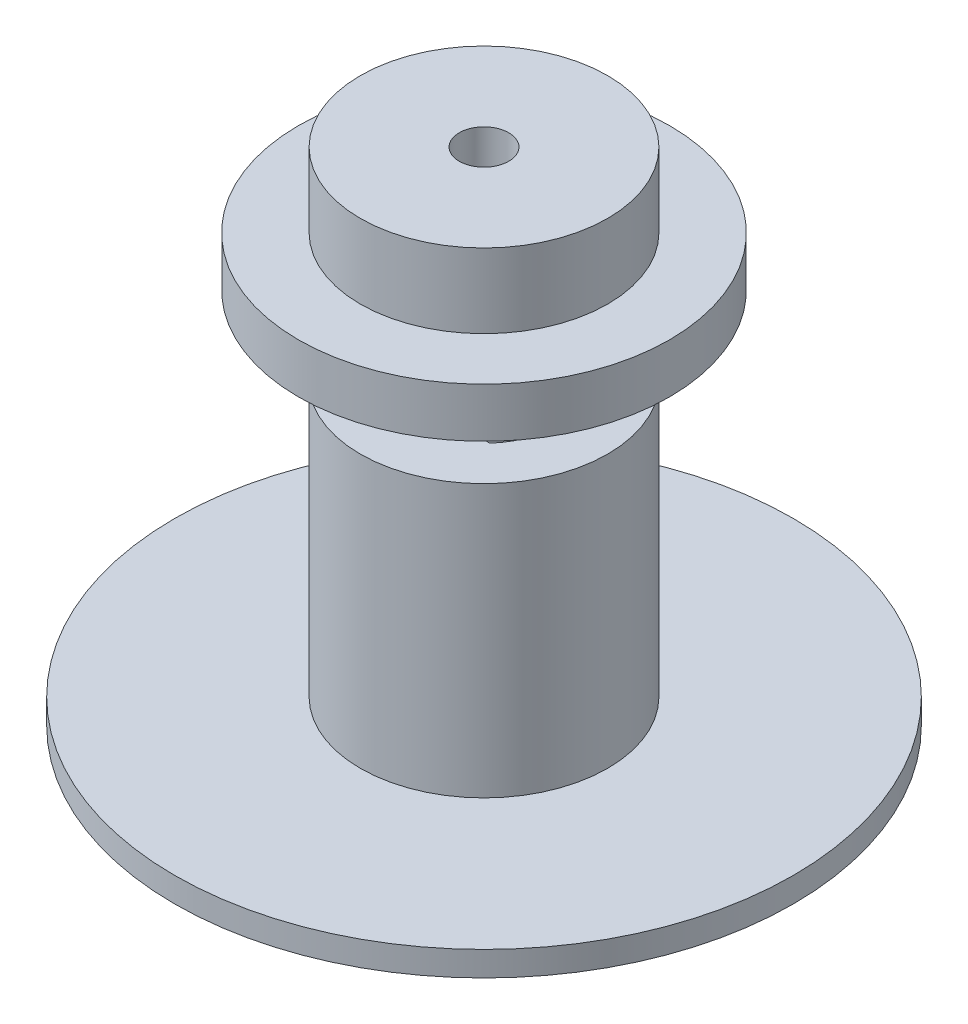
ISO-10303-21;
HEADER;
FILE_DESCRIPTION(('STEP AP214'),'2;1');
FILE_NAME('part.step','',(''),(''),'','','');
FILE_SCHEMA(('AUTOMOTIVE_DESIGN { 1 0 10303 214 1 1 1 1 }'));
ENDSEC;
DATA;
#1=APPLICATION_CONTEXT('core data for automotive mechanical design processes');
#2=APPLICATION_PROTOCOL_DEFINITION('international standard','automotive_design',2000,#1);
#3=PRODUCT_CONTEXT('',#1,'mechanical');
#4=PRODUCT('Part','Part','',(#3));
#5=PRODUCT_RELATED_PRODUCT_CATEGORY('part','',(#4));
#6=PRODUCT_DEFINITION_FORMATION('','',#4);
#7=PRODUCT_DEFINITION_CONTEXT('part definition',#1,'design');
#8=PRODUCT_DEFINITION('design','',#6,#7);
#9=PRODUCT_DEFINITION_SHAPE('','',#8);
#10=(LENGTH_UNIT() NAMED_UNIT(*) SI_UNIT(.MILLI.,.METRE.));
#11=(NAMED_UNIT(*) PLANE_ANGLE_UNIT() SI_UNIT($,.RADIAN.));
#12=(NAMED_UNIT(*) SI_UNIT($,.STERADIAN.) SOLID_ANGLE_UNIT());
#13=UNCERTAINTY_MEASURE_WITH_UNIT(LENGTH_MEASURE(1.E-05),#10,'distance_accuracy_value','');
#14=(GEOMETRIC_REPRESENTATION_CONTEXT(3) GLOBAL_UNCERTAINTY_ASSIGNED_CONTEXT((#13)) GLOBAL_UNIT_ASSIGNED_CONTEXT((#10,
#11,#12)) REPRESENTATION_CONTEXT('',''));
#15=CARTESIAN_POINT('',(0.,0.,0.));
#16=DIRECTION('',(0.,0.,1.));
#17=DIRECTION('',(1.,0.,0.));
#18=AXIS2_PLACEMENT_3D('',#15,#16,#17);
#19=CARTESIAN_POINT('',(0.,-6.,0.));
#20=DIRECTION('',(0.,1.,0.));
#21=DIRECTION('',(0.,0.,1.));
#22=AXIS2_PLACEMENT_3D('',#19,#20,#21);
#23=CYLINDRICAL_SURFACE('',#22,1.);
#24=CARTESIAN_POINT('',(0.,20.25,0.));
#25=DIRECTION('',(0.,1.,0.));
#26=DIRECTION('',(0.,0.,1.));
#27=AXIS2_PLACEMENT_3D('',#24,#25,#26);
#28=CIRCLE('',#27,1.);
#29=CARTESIAN_POINT('',(0.,20.25,1.));
#30=VERTEX_POINT('',#29);
#31=EDGE_CURVE('E61',#30,#30,#28,.F.);
#32=ORIENTED_EDGE('',*,*,#31,.F.);
#33=EDGE_LOOP('',(#32));
#34=FACE_BOUND('',#33,.T.);
#35=CARTESIAN_POINT('',(0.,18.25,0.));
#36=DIRECTION('',(0.,-1.,0.));
#37=DIRECTION('',(0.,0.,-1.));
#38=AXIS2_PLACEMENT_3D('',#35,#36,#37);
#39=CIRCLE('',#38,1.);
#40=CARTESIAN_POINT('',(0.,18.25,-1.));
#41=VERTEX_POINT('',#40);
#42=EDGE_CURVE('E47',#41,#41,#39,.F.);
#43=ORIENTED_EDGE('',*,*,#42,.F.);
#44=EDGE_LOOP('',(#43));
#45=FACE_BOUND('',#44,.T.);
#46=ADVANCED_FACE('F43',(#34,#45),#23,.F.);
#47=CARTESIAN_POINT('',(0.,20.25,0.));
#48=DIRECTION('',(0.,-1.,0.));
#49=DIRECTION('',(0.,0.,-1.));
#50=AXIS2_PLACEMENT_3D('',#47,#48,#49);
#51=CYLINDRICAL_SURFACE('',#50,5.);
#52=CARTESIAN_POINT('',(0.,20.25,0.));
#53=DIRECTION('',(0.,1.,0.));
#54=DIRECTION('',(0.,0.,1.));
#55=AXIS2_PLACEMENT_3D('',#52,#53,#54);
#56=CIRCLE('',#55,5.);
#57=CARTESIAN_POINT('',(0.,20.25,5.));
#58=VERTEX_POINT('',#57);
#59=EDGE_CURVE('E55',#58,#58,#56,.T.);
#60=ORIENTED_EDGE('',*,*,#59,.F.);
#61=EDGE_LOOP('',(#60));
#62=FACE_BOUND('',#61,.T.);
#63=CARTESIAN_POINT('',(0.,17.25,0.));
#64=DIRECTION('',(0.,1.,0.));
#65=DIRECTION('',(0.,0.,1.));
#66=AXIS2_PLACEMENT_3D('',#63,#64,#65);
#67=CIRCLE('',#66,5.);
#68=CARTESIAN_POINT('',(0.,17.25,5.));
#69=VERTEX_POINT('',#68);
#70=EDGE_CURVE('E58',#69,#69,#67,.T.);
#71=ORIENTED_EDGE('',*,*,#70,.T.);
#72=EDGE_LOOP('',(#71));
#73=FACE_BOUND('',#72,.T.);
#74=ADVANCED_FACE('F79',(#62,#73),#51,.T.);
#75=CARTESIAN_POINT('',(0.,20.25,0.));
#76=DIRECTION('',(0.,1.,0.));
#77=DIRECTION('',(0.,0.,1.));
#78=AXIS2_PLACEMENT_3D('',#75,#76,#77);
#79=PLANE('',#78);
#80=ORIENTED_EDGE('',*,*,#59,.T.);
#81=EDGE_LOOP('',(#80));
#82=FACE_BOUND('',#81,.T.);
#83=ORIENTED_EDGE('',*,*,#31,.T.);
#84=EDGE_LOOP('',(#83));
#85=FACE_BOUND('',#84,.T.);
#86=ADVANCED_FACE('F85',(#82,#85),#79,.T.);
#87=CARTESIAN_POINT('',(0.,15.25,0.));
#88=DIRECTION('',(0.,-1.,0.));
#89=DIRECTION('',(0.,0.,-1.));
#90=AXIS2_PLACEMENT_3D('',#87,#88,#89);
#91=PLANE('',#90);
#92=CARTESIAN_POINT('',(0.,15.25,0.));
#93=DIRECTION('',(0.,-1.,0.));
#94=DIRECTION('',(0.,0.,-1.));
#95=AXIS2_PLACEMENT_3D('',#92,#93,#94);
#96=CIRCLE('',#95,4.);
#97=CARTESIAN_POINT('',(0.,15.25,-4.));
#98=VERTEX_POINT('',#97);
#99=EDGE_CURVE('E66',#98,#98,#96,.T.);
#100=ORIENTED_EDGE('',*,*,#99,.F.);
#101=EDGE_LOOP('',(#100));
#102=FACE_BOUND('',#101,.T.);
#103=CARTESIAN_POINT('',(0.,15.25,0.));
#104=DIRECTION('',(0.,-1.,0.));
#105=DIRECTION('',(0.,0.,-1.));
#106=AXIS2_PLACEMENT_3D('',#103,#104,#105);
#107=CIRCLE('',#106,7.5);
#108=CARTESIAN_POINT('',(0.,15.25,-7.5));
#109=VERTEX_POINT('',#108);
#110=EDGE_CURVE('E11',#109,#109,#107,.T.);
#111=ORIENTED_EDGE('',*,*,#110,.T.);
#112=EDGE_LOOP('',(#111));
#113=FACE_BOUND('',#112,.T.);
#114=ADVANCED_FACE('F90',(#102,#113),#91,.T.);
#115=CARTESIAN_POINT('',(0.,19.,0.));
#116=DIRECTION('',(0.,-1.,0.));
#117=DIRECTION('',(0.,0.,-1.));
#118=AXIS2_PLACEMENT_3D('',#115,#116,#117);
#119=CYLINDRICAL_SURFACE('',#118,7.5);
#120=ORIENTED_EDGE('',*,*,#110,.F.);
#121=EDGE_LOOP('',(#120));
#122=FACE_BOUND('',#121,.T.);
#123=CARTESIAN_POINT('',(0.,17.25,0.));
#124=DIRECTION('',(0.,1.,0.));
#125=DIRECTION('',(0.,0.,1.));
#126=AXIS2_PLACEMENT_3D('',#123,#124,#125);
#127=CIRCLE('',#126,7.5);
#128=CARTESIAN_POINT('',(0.,17.25,7.5));
#129=VERTEX_POINT('',#128);
#130=EDGE_CURVE('E51',#129,#129,#127,.T.);
#131=ORIENTED_EDGE('',*,*,#130,.F.);
#132=EDGE_LOOP('',(#131));
#133=FACE_BOUND('',#132,.T.);
#134=ADVANCED_FACE('F45',(#122,#133),#119,.T.);
#135=CARTESIAN_POINT('',(0.,17.25,0.));
#136=DIRECTION('',(0.,1.,0.));
#137=DIRECTION('',(0.,0.,1.));
#138=AXIS2_PLACEMENT_3D('',#135,#136,#137);
#139=PLANE('',#138);
#140=ORIENTED_EDGE('',*,*,#70,.F.);
#141=EDGE_LOOP('',(#140));
#142=FACE_BOUND('',#141,.T.);
#143=ORIENTED_EDGE('',*,*,#130,.T.);
#144=EDGE_LOOP('',(#143));
#145=FACE_BOUND('',#144,.T.);
#146=ADVANCED_FACE('F94',(#142,#145),#139,.T.);
#147=CARTESIAN_POINT('',(0.,18.25,0.));
#148=DIRECTION('',(0.,-1.,0.));
#149=DIRECTION('',(0.,0.,-1.));
#150=AXIS2_PLACEMENT_3D('',#147,#148,#149);
#151=PLANE('',#150);
#152=CARTESIAN_POINT('',(0.,18.25,0.));
#153=DIRECTION('',(0.,-1.,0.));
#154=DIRECTION('',(0.,0.,-1.));
#155=AXIS2_PLACEMENT_3D('',#152,#153,#154);
#156=CIRCLE('',#155,4.);
#157=CARTESIAN_POINT('',(0.,18.25,-4.));
#158=VERTEX_POINT('',#157);
#159=EDGE_CURVE('E69',#158,#158,#156,.T.);
#160=ORIENTED_EDGE('',*,*,#159,.T.);
#161=EDGE_LOOP('',(#160));
#162=FACE_BOUND('',#161,.T.);
#163=ORIENTED_EDGE('',*,*,#42,.T.);
#164=EDGE_LOOP('',(#163));
#165=FACE_BOUND('',#164,.T.);
#166=ADVANCED_FACE('F76',(#162,#165),#151,.T.);
#167=CARTESIAN_POINT('',(0.,18.25,0.));
#168=DIRECTION('',(0.,-1.,0.));
#169=DIRECTION('',(0.,0.,-1.));
#170=AXIS2_PLACEMENT_3D('',#167,#168,#169);
#171=CYLINDRICAL_SURFACE('',#170,4.);
#172=ORIENTED_EDGE('',*,*,#159,.F.);
#173=EDGE_LOOP('',(#172));
#174=FACE_BOUND('',#173,.T.);
#175=ORIENTED_EDGE('',*,*,#99,.T.);
#176=EDGE_LOOP('',(#175));
#177=FACE_BOUND('',#176,.T.);
#178=ADVANCED_FACE('F101',(#174,#177),#171,.F.);
#179=CLOSED_SHELL('',(#46,#74,#86,#114,#134,#146,#166,#178));
#180=MANIFOLD_SOLID_BREP('B2',#179);
#181=CARTESIAN_POINT('',(0.,15.,0.));
#182=DIRECTION('',(0.,-1.,0.));
#183=DIRECTION('',(0.,0.,-1.));
#184=AXIS2_PLACEMENT_3D('',#181,#182,#183);
#185=CYLINDRICAL_SURFACE('',#184,5.);
#186=CARTESIAN_POINT('',(0.,1.,0.));
#187=DIRECTION('',(0.,1.,0.));
#188=DIRECTION('',(0.,0.,1.));
#189=AXIS2_PLACEMENT_3D('',#186,#187,#188);
#190=CIRCLE('',#189,5.);
#191=CARTESIAN_POINT('',(0.,1.,5.));
#192=VERTEX_POINT('',#191);
#193=EDGE_CURVE('E245',#192,#192,#190,.T.);
#194=ORIENTED_EDGE('',*,*,#193,.T.);
#195=EDGE_LOOP('',(#194));
#196=FACE_BOUND('',#195,.T.);
#197=CARTESIAN_POINT('',(0.,12.,0.));
#198=DIRECTION('',(0.,1.,0.));
#199=DIRECTION('',(0.,0.,1.));
#200=AXIS2_PLACEMENT_3D('',#197,#198,#199);
#201=CIRCLE('',#200,5.);
#202=CARTESIAN_POINT('',(0.,12.,5.));
#203=VERTEX_POINT('',#202);
#204=EDGE_CURVE('E267',#203,#203,#201,.T.);
#205=ORIENTED_EDGE('',*,*,#204,.F.);
#206=EDGE_LOOP('',(#205));
#207=FACE_BOUND('',#206,.T.);
#208=ADVANCED_FACE('F182',(#196,#207),#185,.T.);
#209=CARTESIAN_POINT('',(0.,-4.,-2.));
#210=DIRECTION('',(0.,0.,-1.));
#211=DIRECTION('',(-1.,0.,0.));
#212=AXIS2_PLACEMENT_3D('',#209,#210,#211);
#213=PLANE('',#212);
#214=DIRECTION('',(1.,0.,0.));
#215=VECTOR('',#214,1.);
#216=CARTESIAN_POINT('',(0.,12.,-2.));
#217=LINE('',#216,#215);
#218=CARTESIAN_POINT('',(-2.23606797749979,12.,-2.));
#219=VERTEX_POINT('',#218);
#220=CARTESIAN_POINT('',(2.23606797749979,12.,-2.));
#221=VERTEX_POINT('',#220);
#222=EDGE_CURVE('E222',#219,#221,#217,.T.);
#223=ORIENTED_EDGE('',*,*,#222,.F.);
#224=DIRECTION('',(0.,1.,0.));
#225=VECTOR('',#224,1.);
#226=CARTESIAN_POINT('',(-2.23606797749979,-4.,-2.));
#227=LINE('',#226,#225);
#228=CARTESIAN_POINT('',(-2.23606797749979,0.,-2.));
#229=VERTEX_POINT('',#228);
#230=EDGE_CURVE('E204',#229,#219,#227,.T.);
#231=ORIENTED_EDGE('',*,*,#230,.F.);
#232=DIRECTION('',(-1.,0.,0.));
#233=VECTOR('',#232,1.);
#234=CARTESIAN_POINT('',(0.,0.,-2.));
#235=LINE('',#234,#233);
#236=CARTESIAN_POINT('',(2.23606797749979,0.,-2.));
#237=VERTEX_POINT('',#236);
#238=EDGE_CURVE('E248',#237,#229,#235,.T.);
#239=ORIENTED_EDGE('',*,*,#238,.F.);
#240=DIRECTION('',(0.,1.,0.));
#241=VECTOR('',#240,1.);
#242=CARTESIAN_POINT('',(2.23606797749979,-4.,-2.));
#243=LINE('',#242,#241);
#244=EDGE_CURVE('E228',#237,#221,#243,.T.);
#245=ORIENTED_EDGE('',*,*,#244,.T.);
#246=EDGE_LOOP('',(#223,#231,#239,#245));
#247=FACE_BOUND('',#246,.T.);
#248=ADVANCED_FACE('F227',(#247),#213,.F.);
#249=CARTESIAN_POINT('',(0.,-4.,0.));
#250=DIRECTION('',(0.,1.,0.));
#251=DIRECTION('',(0.,0.,1.));
#252=AXIS2_PLACEMENT_3D('',#249,#250,#251);
#253=CYLINDRICAL_SURFACE('',#252,3.);
#254=CARTESIAN_POINT('',(0.,12.,0.));
#255=DIRECTION('',(0.,1.,0.));
#256=DIRECTION('',(0.,0.,1.));
#257=AXIS2_PLACEMENT_3D('',#254,#255,#256);
#258=CIRCLE('',#257,3.);
#259=CARTESIAN_POINT('',(2.23606797749979,12.,2.));
#260=VERTEX_POINT('',#259);
#261=EDGE_CURVE('E230',#221,#260,#258,.F.);
#262=ORIENTED_EDGE('',*,*,#261,.F.);
#263=ORIENTED_EDGE('',*,*,#244,.F.);
#264=CARTESIAN_POINT('',(0.,0.,0.));
#265=DIRECTION('',(0.,1.,0.));
#266=DIRECTION('',(0.,0.,1.));
#267=AXIS2_PLACEMENT_3D('',#264,#265,#266);
#268=CIRCLE('',#267,3.);
#269=CARTESIAN_POINT('',(2.23606797749979,0.,2.));
#270=VERTEX_POINT('',#269);
#271=EDGE_CURVE('E190',#270,#237,#268,.T.);
#272=ORIENTED_EDGE('',*,*,#271,.F.);
#273=DIRECTION('',(0.,1.,0.));
#274=VECTOR('',#273,1.);
#275=CARTESIAN_POINT('',(2.23606797749979,-4.,2.));
#276=LINE('',#275,#274);
#277=EDGE_CURVE('E239',#270,#260,#276,.T.);
#278=ORIENTED_EDGE('',*,*,#277,.T.);
#279=EDGE_LOOP('',(#262,#263,#272,#278));
#280=FACE_BOUND('',#279,.T.);
#281=ADVANCED_FACE('F260',(#280),#253,.F.);
#282=CARTESIAN_POINT('',(0.,-4.,2.));
#283=DIRECTION('',(0.,0.,-1.));
#284=DIRECTION('',(-1.,0.,0.));
#285=AXIS2_PLACEMENT_3D('',#282,#283,#284);
#286=PLANE('',#285);
#287=DIRECTION('',(0.,1.,0.));
#288=VECTOR('',#287,1.);
#289=CARTESIAN_POINT('',(-2.23606797749979,-4.,2.));
#290=LINE('',#289,#288);
#291=CARTESIAN_POINT('',(-2.23606797749979,0.,2.));
#292=VERTEX_POINT('',#291);
#293=CARTESIAN_POINT('',(-2.23606797749979,12.,2.));
#294=VERTEX_POINT('',#293);
#295=EDGE_CURVE('E236',#292,#294,#290,.T.);
#296=ORIENTED_EDGE('',*,*,#295,.T.);
#297=DIRECTION('',(1.,0.,0.));
#298=VECTOR('',#297,1.);
#299=CARTESIAN_POINT('',(0.,12.,2.));
#300=LINE('',#299,#298);
#301=EDGE_CURVE('E196',#294,#260,#300,.T.);
#302=ORIENTED_EDGE('',*,*,#301,.T.);
#303=ORIENTED_EDGE('',*,*,#277,.F.);
#304=DIRECTION('',(1.,0.,0.));
#305=VECTOR('',#304,1.);
#306=CARTESIAN_POINT('',(0.,0.,2.));
#307=LINE('',#306,#305);
#308=EDGE_CURVE('E251',#292,#270,#307,.T.);
#309=ORIENTED_EDGE('',*,*,#308,.F.);
#310=EDGE_LOOP('',(#296,#302,#303,#309));
#311=FACE_BOUND('',#310,.T.);
#312=ADVANCED_FACE('F291',(#311),#286,.T.);
#313=CARTESIAN_POINT('',(0.,-4.,0.));
#314=DIRECTION('',(0.,1.,0.));
#315=DIRECTION('',(0.,0.,1.));
#316=AXIS2_PLACEMENT_3D('',#313,#314,#315);
#317=CYLINDRICAL_SURFACE('',#316,3.);
#318=CARTESIAN_POINT('',(0.,12.,0.));
#319=DIRECTION('',(0.,1.,0.));
#320=DIRECTION('',(0.,0.,1.));
#321=AXIS2_PLACEMENT_3D('',#318,#319,#320);
#322=CIRCLE('',#321,3.);
#323=EDGE_CURVE('E41',#294,#219,#322,.F.);
#324=ORIENTED_EDGE('',*,*,#323,.F.);
#325=ORIENTED_EDGE('',*,*,#295,.F.);
#326=CARTESIAN_POINT('',(0.,0.,0.));
#327=DIRECTION('',(0.,1.,0.));
#328=DIRECTION('',(0.,0.,1.));
#329=AXIS2_PLACEMENT_3D('',#326,#327,#328);
#330=CIRCLE('',#329,3.);
#331=EDGE_CURVE('E234',#229,#292,#330,.T.);
#332=ORIENTED_EDGE('',*,*,#331,.F.);
#333=ORIENTED_EDGE('',*,*,#230,.T.);
#334=EDGE_LOOP('',(#324,#325,#332,#333));
#335=FACE_BOUND('',#334,.T.);
#336=ADVANCED_FACE('F232',(#335),#317,.F.);
#337=CARTESIAN_POINT('',(0.,1.,0.));
#338=DIRECTION('',(0.,1.,0.));
#339=DIRECTION('',(0.,0.,1.));
#340=AXIS2_PLACEMENT_3D('',#337,#338,#339);
#341=PLANE('',#340);
#342=ORIENTED_EDGE('',*,*,#193,.F.);
#343=EDGE_LOOP('',(#342));
#344=FACE_BOUND('',#343,.T.);
#345=CARTESIAN_POINT('',(0.,1.,0.));
#346=DIRECTION('',(0.,1.,0.));
#347=DIRECTION('',(0.,0.,1.));
#348=AXIS2_PLACEMENT_3D('',#345,#346,#347);
#349=CIRCLE('',#348,12.5);
#350=CARTESIAN_POINT('',(0.,1.,12.5));
#351=VERTEX_POINT('',#350);
#352=EDGE_CURVE('E229',#351,#351,#349,.T.);
#353=ORIENTED_EDGE('',*,*,#352,.T.);
#354=EDGE_LOOP('',(#353));
#355=FACE_BOUND('',#354,.T.);
#356=ADVANCED_FACE('F281',(#344,#355),#341,.T.);
#357=CARTESIAN_POINT('',(0.,-35.3553390593274,0.));
#358=DIRECTION('',(0.,1.,0.));
#359=DIRECTION('',(0.,0.,1.));
#360=AXIS2_PLACEMENT_3D('',#357,#358,#359);
#361=CYLINDRICAL_SURFACE('',#360,12.5);
#362=CARTESIAN_POINT('',(0.,0.,0.));
#363=DIRECTION('',(0.,1.,0.));
#364=DIRECTION('',(0.,0.,1.));
#365=AXIS2_PLACEMENT_3D('',#362,#363,#364);
#366=CIRCLE('',#365,12.5);
#367=CARTESIAN_POINT('',(0.,0.,12.5));
#368=VERTEX_POINT('',#367);
#369=EDGE_CURVE('E237',#368,#368,#366,.F.);
#370=ORIENTED_EDGE('',*,*,#369,.F.);
#371=EDGE_LOOP('',(#370));
#372=FACE_BOUND('',#371,.T.);
#373=ORIENTED_EDGE('',*,*,#352,.F.);
#374=EDGE_LOOP('',(#373));
#375=FACE_BOUND('',#374,.T.);
#376=ADVANCED_FACE('F283',(#372,#375),#361,.T.);
#377=CARTESIAN_POINT('',(0.,0.,0.));
#378=DIRECTION('',(0.,1.,0.));
#379=DIRECTION('',(0.,0.,1.));
#380=AXIS2_PLACEMENT_3D('',#377,#378,#379);
#381=PLANE('',#380);
#382=ORIENTED_EDGE('',*,*,#308,.T.);
#383=ORIENTED_EDGE('',*,*,#271,.T.);
#384=ORIENTED_EDGE('',*,*,#238,.T.);
#385=ORIENTED_EDGE('',*,*,#331,.T.);
#386=EDGE_LOOP('',(#382,#383,#384,#385));
#387=FACE_BOUND('',#386,.T.);
#388=ORIENTED_EDGE('',*,*,#369,.T.);
#389=EDGE_LOOP('',(#388));
#390=FACE_BOUND('',#389,.T.);
#391=ADVANCED_FACE('F184',(#387,#390),#381,.F.);
#392=CARTESIAN_POINT('',(0.,12.,0.));
#393=DIRECTION('',(0.,1.,0.));
#394=DIRECTION('',(0.,0.,1.));
#395=AXIS2_PLACEMENT_3D('',#392,#393,#394);
#396=PLANE('',#395);
#397=ORIENTED_EDGE('',*,*,#204,.T.);
#398=EDGE_LOOP('',(#397));
#399=FACE_BOUND('',#398,.T.);
#400=ORIENTED_EDGE('',*,*,#222,.T.);
#401=ORIENTED_EDGE('',*,*,#261,.T.);
#402=ORIENTED_EDGE('',*,*,#301,.F.);
#403=ORIENTED_EDGE('',*,*,#323,.T.);
#404=EDGE_LOOP('',(#400,#401,#402,#403));
#405=FACE_BOUND('',#404,.T.);
#406=ADVANCED_FACE('F221',(#399,#405),#396,.T.);
#407=CLOSED_SHELL('',(#208,#248,#281,#312,#336,#356,#376,#391,#406));
#408=MANIFOLD_SOLID_BREP('B6',#407);
#409=ADVANCED_BREP_SHAPE_REPRESENTATION('',(#18,#180,#408),#14);
#410=SHAPE_DEFINITION_REPRESENTATION(#9,#409);
ENDSEC;
END-ISO-10303-21;
